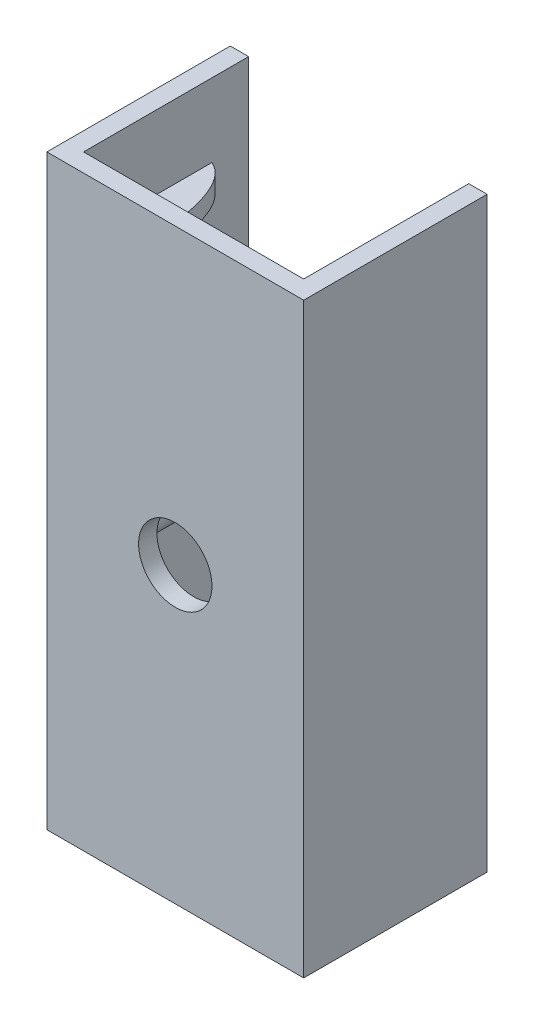
ISO-10303-21;
HEADER;
FILE_DESCRIPTION(('STEP AP214'),'2;1');
FILE_NAME('part.step','',(''),(''),'','','');
FILE_SCHEMA(('AUTOMOTIVE_DESIGN { 1 0 10303 214 1 1 1 1 }'));
ENDSEC;
DATA;
#1=APPLICATION_CONTEXT('core data for automotive mechanical design processes');
#2=APPLICATION_PROTOCOL_DEFINITION('international standard','automotive_design',2000,#1);
#3=PRODUCT_CONTEXT('',#1,'mechanical');
#4=PRODUCT('Part','Part','',(#3));
#5=PRODUCT_RELATED_PRODUCT_CATEGORY('part','',(#4));
#6=PRODUCT_DEFINITION_FORMATION('','',#4);
#7=PRODUCT_DEFINITION_CONTEXT('part definition',#1,'design');
#8=PRODUCT_DEFINITION('design','',#6,#7);
#9=PRODUCT_DEFINITION_SHAPE('','',#8);
#10=(LENGTH_UNIT() NAMED_UNIT(*) SI_UNIT(.MILLI.,.METRE.));
#11=(NAMED_UNIT(*) PLANE_ANGLE_UNIT() SI_UNIT($,.RADIAN.));
#12=(NAMED_UNIT(*) SI_UNIT($,.STERADIAN.) SOLID_ANGLE_UNIT());
#13=UNCERTAINTY_MEASURE_WITH_UNIT(LENGTH_MEASURE(1.E-05),#10,'distance_accuracy_value','');
#14=(GEOMETRIC_REPRESENTATION_CONTEXT(3) GLOBAL_UNCERTAINTY_ASSIGNED_CONTEXT((#13)) GLOBAL_UNIT_ASSIGNED_CONTEXT((#10,
#11,#12)) REPRESENTATION_CONTEXT('',''));
#15=CARTESIAN_POINT('',(0.,0.,0.));
#16=DIRECTION('',(0.,0.,1.));
#17=DIRECTION('',(1.,0.,0.));
#18=AXIS2_PLACEMENT_3D('',#15,#16,#17);
#19=CARTESIAN_POINT('',(0.,0.,-1000.));
#20=DIRECTION('',(0.,0.,1.));
#21=DIRECTION('',(1.,0.,0.));
#22=AXIS2_PLACEMENT_3D('',#19,#20,#21);
#23=PLANE('',#22);
#24=CARTESIAN_POINT('',(124743.416897498,168337.836627923,-1000.));
#25=DIRECTION('',(0.,0.,1.));
#26=DIRECTION('',(1.,0.,0.));
#27=AXIS2_PLACEMENT_3D('',#24,#25,#26);
#28=CIRCLE('',#27,2000.);
#29=CARTESIAN_POINT('',(126743.416897498,168337.836627923,-1000.));
#30=VERTEX_POINT('',#29);
#31=EDGE_CURVE('E490',#30,#30,#28,.T.);
#32=ORIENTED_EDGE('',*,*,#31,.T.);
#33=EDGE_LOOP('',(#32));
#34=FACE_BOUND('',#33,.T.);
#35=DIRECTION('',(0.,-1.,0.));
#36=VECTOR('',#35,1.);
#37=CARTESIAN_POINT('',(130743.416897498,0.,-1000.));
#38=LINE('',#37,#36);
#39=CARTESIAN_POINT('',(130743.416897498,184337.836627923,-1000.));
#40=VERTEX_POINT('',#39);
#41=CARTESIAN_POINT('',(130743.416897498,180337.836627923,-1000.));
#42=VERTEX_POINT('',#41);
#43=EDGE_CURVE('E493',#40,#42,#38,.T.);
#44=ORIENTED_EDGE('',*,*,#43,.T.);
#45=DIRECTION('',(-1.,0.,0.));
#46=VECTOR('',#45,1.);
#47=CARTESIAN_POINT('',(-1.48029736616685E-13,180337.836627923,-999.999999999984));
#48=LINE('',#47,#46);
#49=CARTESIAN_POINT('',(128743.416897498,180337.836627923,-1000.));
#50=VERTEX_POINT('',#49);
#51=EDGE_CURVE('E262',#42,#50,#48,.T.);
#52=ORIENTED_EDGE('',*,*,#51,.T.);
#53=DIRECTION('',(0.,-1.,0.));
#54=VECTOR('',#53,1.);
#55=CARTESIAN_POINT('',(128743.416897498,180337.836627923,-1000.));
#56=LINE('',#55,#54);
#57=CARTESIAN_POINT('',(128743.416897498,179337.836627923,-1000.));
#58=VERTEX_POINT('',#57);
#59=EDGE_CURVE('E256',#50,#58,#56,.T.);
#60=ORIENTED_EDGE('',*,*,#59,.T.);
#61=DIRECTION('',(-1.,0.,0.));
#62=VECTOR('',#61,1.);
#63=CARTESIAN_POINT('',(-1.48029736616685E-13,179337.836627923,-999.999999999984));
#64=LINE('',#63,#62);
#65=CARTESIAN_POINT('',(130743.416897498,179337.836627923,-1000.));
#66=VERTEX_POINT('',#65);
#67=EDGE_CURVE('E245',#66,#58,#64,.T.);
#68=ORIENTED_EDGE('',*,*,#67,.F.);
#69=CARTESIAN_POINT('',(130743.416897498,170237.836627923,-1000.));
#70=VERTEX_POINT('',#69);
#71=EDGE_CURVE('E498',#66,#70,#38,.T.);
#72=ORIENTED_EDGE('',*,*,#71,.T.);
#73=DIRECTION('',(-1.,0.,0.));
#74=VECTOR('',#73,1.);
#75=CARTESIAN_POINT('',(0.,170237.836627923,-1000.));
#76=LINE('',#75,#74);
#77=CARTESIAN_POINT('',(129243.416897498,170237.836627923,-1000.));
#78=VERTEX_POINT('',#77);
#79=EDGE_CURVE('E519',#70,#78,#76,.T.);
#80=ORIENTED_EDGE('',*,*,#79,.T.);
#81=CARTESIAN_POINT('',(129243.416897498,168837.836627923,-1000.));
#82=DIRECTION('',(0.,0.,1.));
#83=DIRECTION('',(1.,0.,0.));
#84=AXIS2_PLACEMENT_3D('',#81,#82,#83);
#85=CIRCLE('',#84,1400.00000000001);
#86=CARTESIAN_POINT('',(127843.416897498,168837.836627923,-1000.));
#87=VERTEX_POINT('',#86);
#88=EDGE_CURVE('E516',#78,#87,#85,.T.);
#89=ORIENTED_EDGE('',*,*,#88,.T.);
#90=DIRECTION('',(0.,-1.,0.));
#91=VECTOR('',#90,1.);
#92=CARTESIAN_POINT('',(127843.416897496,-1.81676422382531E-09,-1000.));
#93=LINE('',#92,#91);
#94=CARTESIAN_POINT('',(127843.416897498,167837.836627923,-1000.));
#95=VERTEX_POINT('',#94);
#96=EDGE_CURVE('E513',#87,#95,#93,.T.);
#97=ORIENTED_EDGE('',*,*,#96,.T.);
#98=CARTESIAN_POINT('',(129243.416897498,167837.836627923,-1000.));
#99=DIRECTION('',(0.,0.,1.));
#100=DIRECTION('',(1.,0.,0.));
#101=AXIS2_PLACEMENT_3D('',#98,#99,#100);
#102=CIRCLE('',#101,1400.00000000001);
#103=CARTESIAN_POINT('',(129243.416897498,166437.836627923,-1000.));
#104=VERTEX_POINT('',#103);
#105=EDGE_CURVE('E510',#95,#104,#102,.T.);
#106=ORIENTED_EDGE('',*,*,#105,.T.);
#107=DIRECTION('',(1.,0.,0.));
#108=VECTOR('',#107,1.);
#109=CARTESIAN_POINT('',(0.,166437.836627923,-1000.));
#110=LINE('',#109,#108);
#111=CARTESIAN_POINT('',(130743.416897498,166437.836627923,-1000.));
#112=VERTEX_POINT('',#111);
#113=EDGE_CURVE('E507',#104,#112,#110,.T.);
#114=ORIENTED_EDGE('',*,*,#113,.T.);
#115=DIRECTION('',(0.,-1.,0.));
#116=VECTOR('',#115,1.);
#117=CARTESIAN_POINT('',(130743.416897498,0.,-1000.));
#118=LINE('',#117,#116);
#119=CARTESIAN_POINT('',(130743.416897498,157337.836627923,-1000.));
#120=VERTEX_POINT('',#119);
#121=EDGE_CURVE('E500',#112,#120,#118,.T.);
#122=ORIENTED_EDGE('',*,*,#121,.T.);
#123=DIRECTION('',(-1.,0.,0.));
#124=VECTOR('',#123,1.);
#125=CARTESIAN_POINT('',(-1.48029736616685E-13,157337.836627923,-999.999999999984));
#126=LINE('',#125,#124);
#127=CARTESIAN_POINT('',(128743.416897498,157337.836627923,-1000.));
#128=VERTEX_POINT('',#127);
#129=EDGE_CURVE('E344',#120,#128,#126,.T.);
#130=ORIENTED_EDGE('',*,*,#129,.T.);
#131=DIRECTION('',(0.,1.,0.));
#132=VECTOR('',#131,1.);
#133=CARTESIAN_POINT('',(128743.416897498,156337.836627923,-1000.));
#134=LINE('',#133,#132);
#135=CARTESIAN_POINT('',(128743.416897498,156337.836627923,-1000.));
#136=VERTEX_POINT('',#135);
#137=EDGE_CURVE('E636',#136,#128,#134,.T.);
#138=ORIENTED_EDGE('',*,*,#137,.F.);
#139=DIRECTION('',(-1.,0.,0.));
#140=VECTOR('',#139,1.);
#141=CARTESIAN_POINT('',(-1.48029736616685E-13,156337.836627923,-999.999999999984));
#142=LINE('',#141,#140);
#143=CARTESIAN_POINT('',(130743.416897498,156337.836627923,-1000.));
#144=VERTEX_POINT('',#143);
#145=EDGE_CURVE('E358',#144,#136,#142,.T.);
#146=ORIENTED_EDGE('',*,*,#145,.F.);
#147=CARTESIAN_POINT('',(130743.416897498,152337.836627923,-1000.));
#148=VERTEX_POINT('',#147);
#149=EDGE_CURVE('E504',#144,#148,#118,.T.);
#150=ORIENTED_EDGE('',*,*,#149,.T.);
#151=DIRECTION('',(1.,0.,0.));
#152=VECTOR('',#151,1.);
#153=CARTESIAN_POINT('',(0.,152337.836627923,-1000.));
#154=LINE('',#153,#152);
#155=CARTESIAN_POINT('',(118743.416897498,152337.836627923,-1000.));
#156=VERTEX_POINT('',#155);
#157=EDGE_CURVE('E479',#156,#148,#154,.T.);
#158=ORIENTED_EDGE('',*,*,#157,.F.);
#159=DIRECTION('',(0.,1.,0.));
#160=VECTOR('',#159,1.);
#161=CARTESIAN_POINT('',(118743.416897498,0.,-1000.));
#162=LINE('',#161,#160);
#163=CARTESIAN_POINT('',(118743.416897498,156337.836627923,-1000.));
#164=VERTEX_POINT('',#163);
#165=EDGE_CURVE('E584',#156,#164,#162,.T.);
#166=ORIENTED_EDGE('',*,*,#165,.T.);
#167=DIRECTION('',(-1.,0.,0.));
#168=VECTOR('',#167,1.);
#169=CARTESIAN_POINT('',(-1.48029736616685E-13,156337.836627923,-999.999999999984));
#170=LINE('',#169,#168);
#171=CARTESIAN_POINT('',(120743.416897498,156337.836627923,-1000.));
#172=VERTEX_POINT('',#171);
#173=EDGE_CURVE('E322',#172,#164,#170,.T.);
#174=ORIENTED_EDGE('',*,*,#173,.F.);
#175=DIRECTION('',(0.,-1.,0.));
#176=VECTOR('',#175,1.);
#177=CARTESIAN_POINT('',(120743.416897498,157337.836627923,-1000.));
#178=LINE('',#177,#176);
#179=CARTESIAN_POINT('',(120743.416897498,157337.836627923,-1000.));
#180=VERTEX_POINT('',#179);
#181=EDGE_CURVE('E332',#180,#172,#178,.T.);
#182=ORIENTED_EDGE('',*,*,#181,.F.);
#183=DIRECTION('',(-1.,0.,0.));
#184=VECTOR('',#183,1.);
#185=CARTESIAN_POINT('',(-1.48029736616685E-13,157337.836627923,-999.999999999984));
#186=LINE('',#185,#184);
#187=CARTESIAN_POINT('',(118743.416897498,157337.836627923,-1000.));
#188=VERTEX_POINT('',#187);
#189=EDGE_CURVE('E329',#180,#188,#186,.T.);
#190=ORIENTED_EDGE('',*,*,#189,.T.);
#191=CARTESIAN_POINT('',(118743.416897498,166437.836627923,-1000.));
#192=VERTEX_POINT('',#191);
#193=EDGE_CURVE('E587',#188,#192,#162,.T.);
#194=ORIENTED_EDGE('',*,*,#193,.T.);
#195=DIRECTION('',(-1.,0.,0.));
#196=VECTOR('',#195,1.);
#197=CARTESIAN_POINT('',(0.,166437.836627923,-1000.));
#198=LINE('',#197,#196);
#199=CARTESIAN_POINT('',(120243.416897498,166437.836627923,-1000.));
#200=VERTEX_POINT('',#199);
#201=EDGE_CURVE('E581',#200,#192,#198,.T.);
#202=ORIENTED_EDGE('',*,*,#201,.F.);
#203=CARTESIAN_POINT('',(120243.416897498,167837.836627923,-1000.));
#204=DIRECTION('',(0.,0.,1.));
#205=DIRECTION('',(1.,0.,0.));
#206=AXIS2_PLACEMENT_3D('',#203,#204,#205);
#207=CIRCLE('',#206,1400.00000000001);
#208=CARTESIAN_POINT('',(121643.416897498,167837.836627923,-1000.));
#209=VERTEX_POINT('',#208);
#210=EDGE_CURVE('E579',#209,#200,#207,.F.);
#211=ORIENTED_EDGE('',*,*,#210,.F.);
#212=DIRECTION('',(0.,-1.,0.));
#213=VECTOR('',#212,1.);
#214=CARTESIAN_POINT('',(121643.416897501,1.72865692459113E-09,-1000.));
#215=LINE('',#214,#213);
#216=CARTESIAN_POINT('',(121643.416897498,168837.836627923,-1000.));
#217=VERTEX_POINT('',#216);
#218=EDGE_CURVE('E577',#217,#209,#215,.T.);
#219=ORIENTED_EDGE('',*,*,#218,.F.);
#220=CARTESIAN_POINT('',(120243.416897498,168837.836627923,-1000.));
#221=DIRECTION('',(0.,0.,1.));
#222=DIRECTION('',(1.,0.,0.));
#223=AXIS2_PLACEMENT_3D('',#220,#221,#222);
#224=CIRCLE('',#223,1400.00000000001);
#225=CARTESIAN_POINT('',(120243.416897498,170237.836627923,-1000.));
#226=VERTEX_POINT('',#225);
#227=EDGE_CURVE('E575',#226,#217,#224,.F.);
#228=ORIENTED_EDGE('',*,*,#227,.F.);
#229=DIRECTION('',(1.,0.,0.));
#230=VECTOR('',#229,1.);
#231=CARTESIAN_POINT('',(0.,170237.836627923,-1000.));
#232=LINE('',#231,#230);
#233=CARTESIAN_POINT('',(118743.416897498,170237.836627923,-1000.));
#234=VERTEX_POINT('',#233);
#235=EDGE_CURVE('E573',#234,#226,#232,.T.);
#236=ORIENTED_EDGE('',*,*,#235,.F.);
#237=DIRECTION('',(0.,1.,0.));
#238=VECTOR('',#237,1.);
#239=CARTESIAN_POINT('',(118743.416897498,0.,-1000.));
#240=LINE('',#239,#238);
#241=CARTESIAN_POINT('',(118743.416897498,179337.836627923,-1000.));
#242=VERTEX_POINT('',#241);
#243=EDGE_CURVE('E570',#234,#242,#240,.T.);
#244=ORIENTED_EDGE('',*,*,#243,.T.);
#245=DIRECTION('',(-1.,0.,0.));
#246=VECTOR('',#245,1.);
#247=CARTESIAN_POINT('',(-1.48029736616685E-13,179337.836627923,-999.999999999984));
#248=LINE('',#247,#246);
#249=CARTESIAN_POINT('',(120743.416897498,179337.836627923,-999.999999999993));
#250=VERTEX_POINT('',#249);
#251=EDGE_CURVE('E60',#250,#242,#248,.T.);
#252=ORIENTED_EDGE('',*,*,#251,.F.);
#253=DIRECTION('',(0.,1.,0.));
#254=VECTOR('',#253,1.);
#255=CARTESIAN_POINT('',(120743.416897498,179337.836627923,-1000.));
#256=LINE('',#255,#254);
#257=CARTESIAN_POINT('',(120743.416897498,180337.836627923,-1000.));
#258=VERTEX_POINT('',#257);
#259=EDGE_CURVE('E668',#250,#258,#256,.T.);
#260=ORIENTED_EDGE('',*,*,#259,.T.);
#261=DIRECTION('',(-1.,0.,0.));
#262=VECTOR('',#261,1.);
#263=CARTESIAN_POINT('',(-1.48029736616685E-13,180337.836627923,-999.999999999984));
#264=LINE('',#263,#262);
#265=CARTESIAN_POINT('',(118743.416897498,180337.836627923,-1000.));
#266=VERTEX_POINT('',#265);
#267=EDGE_CURVE('E279',#258,#266,#264,.T.);
#268=ORIENTED_EDGE('',*,*,#267,.T.);
#269=CARTESIAN_POINT('',(118743.416897498,184337.836627923,-1000.));
#270=VERTEX_POINT('',#269);
#271=EDGE_CURVE('E572',#266,#270,#240,.T.);
#272=ORIENTED_EDGE('',*,*,#271,.T.);
#273=DIRECTION('',(-1.,0.,0.));
#274=VECTOR('',#273,1.);
#275=CARTESIAN_POINT('',(0.,184337.836627923,-1000.));
#276=LINE('',#275,#274);
#277=EDGE_CURVE('E484',#40,#270,#276,.T.);
#278=ORIENTED_EDGE('',*,*,#277,.F.);
#279=EDGE_LOOP('',(#44,#52,#60,#68,#72,#80,#89,#97,#106,#114,#122,#130,#138,#146,#150,#158,#166,
#174,#182,#190,#194,#202,#211,#219,#228,#236,#244,#252,#260,#268,#272,#278));
#280=FACE_BOUND('',#279,.T.);
#281=ADVANCED_FACE('F35',(#34,#280),#23,.F.);
#282=CARTESIAN_POINT('',(118743.416897498,0.,-10000.));
#283=DIRECTION('',(1.,0.,0.));
#284=DIRECTION('',(0.,0.,-1.));
#285=AXIS2_PLACEMENT_3D('',#282,#283,#284);
#286=PLANE('',#285);
#287=DIRECTION('',(0.,1.,0.));
#288=VECTOR('',#287,1.);
#289=CARTESIAN_POINT('',(118743.416897498,179337.836627923,-8000.));
#290=LINE('',#289,#288);
#291=CARTESIAN_POINT('',(118743.416897498,179337.836627923,-8000.00000000018));
#292=VERTEX_POINT('',#291);
#293=CARTESIAN_POINT('',(118743.416897498,180337.836627923,-8000.00000000014));
#294=VERTEX_POINT('',#293);
#295=EDGE_CURVE('E673',#292,#294,#290,.T.);
#296=ORIENTED_EDGE('',*,*,#295,.F.);
#297=DIRECTION('',(0.,0.,-1.));
#298=VECTOR('',#297,1.);
#299=CARTESIAN_POINT('',(118743.416897498,179337.836627923,0.));
#300=LINE('',#299,#298);
#301=EDGE_CURVE('E287',#242,#292,#300,.T.);
#302=ORIENTED_EDGE('',*,*,#301,.F.);
#303=ORIENTED_EDGE('',*,*,#243,.F.);
#304=DIRECTION('',(0.,0.,1.));
#305=VECTOR('',#304,1.);
#306=CARTESIAN_POINT('',(118743.416897498,170237.836627923,-10000.));
#307=LINE('',#306,#305);
#308=CARTESIAN_POINT('',(118743.416897498,170237.836627923,-10000.));
#309=VERTEX_POINT('',#308);
#310=EDGE_CURVE('E606',#309,#234,#307,.T.);
#311=ORIENTED_EDGE('',*,*,#310,.F.);
#312=DIRECTION('',(0.,1.,0.));
#313=VECTOR('',#312,1.);
#314=CARTESIAN_POINT('',(118743.416897498,0.,-10000.));
#315=LINE('',#314,#313);
#316=CARTESIAN_POINT('',(118743.416897498,184337.836627923,-10000.));
#317=VERTEX_POINT('',#316);
#318=EDGE_CURVE('E591',#309,#317,#315,.T.);
#319=ORIENTED_EDGE('',*,*,#318,.T.);
#320=DIRECTION('',(0.,0.,1.));
#321=VECTOR('',#320,1.);
#322=CARTESIAN_POINT('',(118743.416897498,184337.836627923,-10000.));
#323=LINE('',#322,#321);
#324=EDGE_CURVE('E609',#317,#270,#323,.T.);
#325=ORIENTED_EDGE('',*,*,#324,.T.);
#326=ORIENTED_EDGE('',*,*,#271,.F.);
#327=DIRECTION('',(0.,0.,-1.));
#328=VECTOR('',#327,1.);
#329=CARTESIAN_POINT('',(118743.416897498,180337.836627923,0.));
#330=LINE('',#329,#328);
#331=EDGE_CURVE('E274',#266,#294,#330,.T.);
#332=ORIENTED_EDGE('',*,*,#331,.T.);
#333=EDGE_LOOP('',(#296,#302,#303,#311,#319,#325,#326,#332));
#334=FACE_BOUND('',#333,.T.);
#335=ADVANCED_FACE('F374',(#334),#286,.T.);
#336=CARTESIAN_POINT('',(130743.416897498,0.,-10000.));
#337=DIRECTION('',(-1.,0.,0.));
#338=DIRECTION('',(0.,0.,1.));
#339=AXIS2_PLACEMENT_3D('',#336,#337,#338);
#340=PLANE('',#339);
#341=ORIENTED_EDGE('',*,*,#149,.F.);
#342=DIRECTION('',(0.,0.,1.));
#343=VECTOR('',#342,1.);
#344=CARTESIAN_POINT('',(130743.416897498,156337.836627923,0.));
#345=LINE('',#344,#343);
#346=CARTESIAN_POINT('',(130743.416897498,156337.836627923,-8000.));
#347=VERTEX_POINT('',#346);
#348=EDGE_CURVE('E349',#347,#144,#345,.T.);
#349=ORIENTED_EDGE('',*,*,#348,.F.);
#350=DIRECTION('',(0.,1.,0.));
#351=VECTOR('',#350,1.);
#352=CARTESIAN_POINT('',(130743.416897498,156337.836627923,-8000.));
#353=LINE('',#352,#351);
#354=CARTESIAN_POINT('',(130743.416897498,157337.836627923,-8000.));
#355=VERTEX_POINT('',#354);
#356=EDGE_CURVE('E637',#347,#355,#353,.T.);
#357=ORIENTED_EDGE('',*,*,#356,.T.);
#358=DIRECTION('',(0.,0.,1.));
#359=VECTOR('',#358,1.);
#360=CARTESIAN_POINT('',(130743.416897498,157337.836627923,0.));
#361=LINE('',#360,#359);
#362=EDGE_CURVE('E337',#355,#120,#361,.T.);
#363=ORIENTED_EDGE('',*,*,#362,.T.);
#364=ORIENTED_EDGE('',*,*,#121,.F.);
#365=DIRECTION('',(0.,0.,1.));
#366=VECTOR('',#365,1.);
#367=CARTESIAN_POINT('',(130743.416897498,166437.836627923,-10000.));
#368=LINE('',#367,#366);
#369=CARTESIAN_POINT('',(130743.416897498,166437.836627923,-10000.));
#370=VERTEX_POINT('',#369);
#371=EDGE_CURVE('E537',#370,#112,#368,.T.);
#372=ORIENTED_EDGE('',*,*,#371,.F.);
#373=DIRECTION('',(0.,-1.,0.));
#374=VECTOR('',#373,1.);
#375=CARTESIAN_POINT('',(130743.416897498,0.,-10000.));
#376=LINE('',#375,#374);
#377=CARTESIAN_POINT('',(130743.416897498,152337.836627923,-10000.));
#378=VERTEX_POINT('',#377);
#379=EDGE_CURVE('E549',#370,#378,#376,.T.);
#380=ORIENTED_EDGE('',*,*,#379,.T.);
#381=DIRECTION('',(0.,0.,1.));
#382=VECTOR('',#381,1.);
#383=CARTESIAN_POINT('',(130743.416897498,152337.836627923,-10000.));
#384=LINE('',#383,#382);
#385=EDGE_CURVE('E540',#378,#148,#384,.T.);
#386=ORIENTED_EDGE('',*,*,#385,.T.);
#387=EDGE_LOOP('',(#341,#349,#357,#363,#364,#372,#380,#386));
#388=FACE_BOUND('',#387,.T.);
#389=ADVANCED_FACE('F377',(#388),#340,.T.);
#390=CARTESIAN_POINT('',(117743.416897498,0.,-1000.));
#391=DIRECTION('',(-1.,0.,0.));
#392=DIRECTION('',(0.,0.,1.));
#393=AXIS2_PLACEMENT_3D('',#390,#391,#392);
#394=PLANE('',#393);
#395=DIRECTION('',(0.,-1.,0.));
#396=VECTOR('',#395,1.);
#397=CARTESIAN_POINT('',(117743.416897498,0.,0.));
#398=LINE('',#397,#396);
#399=CARTESIAN_POINT('',(117743.416897498,184337.836627923,0.));
#400=VERTEX_POINT('',#399);
#401=CARTESIAN_POINT('',(117743.416897498,152337.836627923,0.));
#402=VERTEX_POINT('',#401);
#403=EDGE_CURVE('E474',#400,#402,#398,.T.);
#404=ORIENTED_EDGE('',*,*,#403,.F.);
#405=DIRECTION('',(0.,0.,1.));
#406=VECTOR('',#405,1.);
#407=CARTESIAN_POINT('',(117743.416897498,184337.836627923,-1000.));
#408=LINE('',#407,#406);
#409=CARTESIAN_POINT('',(117743.416897498,184337.836627923,-10000.));
#410=VERTEX_POINT('',#409);
#411=EDGE_CURVE('E11',#410,#400,#408,.T.);
#412=ORIENTED_EDGE('',*,*,#411,.F.);
#413=DIRECTION('',(0.,-1.,0.));
#414=VECTOR('',#413,1.);
#415=CARTESIAN_POINT('',(117743.416897498,0.,-10000.));
#416=LINE('',#415,#414);
#417=CARTESIAN_POINT('',(117743.416897498,152337.836627923,-10000.));
#418=VERTEX_POINT('',#417);
#419=EDGE_CURVE('E630',#410,#418,#416,.T.);
#420=ORIENTED_EDGE('',*,*,#419,.T.);
#421=DIRECTION('',(0.,0.,1.));
#422=VECTOR('',#421,1.);
#423=CARTESIAN_POINT('',(117743.416897498,152337.836627923,-1000.));
#424=LINE('',#423,#422);
#425=EDGE_CURVE('E39',#418,#402,#424,.T.);
#426=ORIENTED_EDGE('',*,*,#425,.T.);
#427=EDGE_LOOP('',(#404,#412,#420,#426));
#428=FACE_BOUND('',#427,.T.);
#429=ADVANCED_FACE('F37',(#428),#394,.T.);
#430=CARTESIAN_POINT('',(0.,184337.836627923,-1000.));
#431=DIRECTION('',(0.,1.,0.));
#432=DIRECTION('',(0.,0.,1.));
#433=AXIS2_PLACEMENT_3D('',#430,#431,#432);
#434=PLANE('',#433);
#435=ORIENTED_EDGE('',*,*,#277,.T.);
#436=ORIENTED_EDGE('',*,*,#324,.F.);
#437=DIRECTION('',(-1.,0.,0.));
#438=VECTOR('',#437,1.);
#439=CARTESIAN_POINT('',(0.,184337.836627923,-10000.));
#440=LINE('',#439,#438);
#441=EDGE_CURVE('E633',#317,#410,#440,.T.);
#442=ORIENTED_EDGE('',*,*,#441,.T.);
#443=ORIENTED_EDGE('',*,*,#411,.T.);
#444=DIRECTION('',(-1.,0.,0.));
#445=VECTOR('',#444,1.);
#446=CARTESIAN_POINT('',(0.,184337.836627923,0.));
#447=LINE('',#446,#445);
#448=CARTESIAN_POINT('',(131743.416897498,184337.836627923,0.));
#449=VERTEX_POINT('',#448);
#450=EDGE_CURVE('E470',#449,#400,#447,.T.);
#451=ORIENTED_EDGE('',*,*,#450,.F.);
#452=DIRECTION('',(0.,0.,1.));
#453=VECTOR('',#452,1.);
#454=CARTESIAN_POINT('',(131743.416897498,184337.836627923,-1000.));
#455=LINE('',#454,#453);
#456=CARTESIAN_POINT('',(131743.416897498,184337.836627923,-10000.));
#457=VERTEX_POINT('',#456);
#458=EDGE_CURVE('E44',#457,#449,#455,.T.);
#459=ORIENTED_EDGE('',*,*,#458,.F.);
#460=DIRECTION('',(-1.,0.,0.));
#461=VECTOR('',#460,1.);
#462=CARTESIAN_POINT('',(0.,184337.836627923,-10000.));
#463=LINE('',#462,#461);
#464=CARTESIAN_POINT('',(130743.416897498,184337.836627923,-10000.));
#465=VERTEX_POINT('',#464);
#466=EDGE_CURVE('E526',#457,#465,#463,.T.);
#467=ORIENTED_EDGE('',*,*,#466,.T.);
#468=DIRECTION('',(0.,0.,1.));
#469=VECTOR('',#468,1.);
#470=CARTESIAN_POINT('',(130743.416897498,184337.836627923,-10000.));
#471=LINE('',#470,#469);
#472=EDGE_CURVE('E521',#465,#40,#471,.T.);
#473=ORIENTED_EDGE('',*,*,#472,.T.);
#474=EDGE_LOOP('',(#435,#436,#442,#443,#451,#459,#467,#473));
#475=FACE_BOUND('',#474,.T.);
#476=ADVANCED_FACE('F445',(#475),#434,.T.);
#477=CARTESIAN_POINT('',(131743.416897498,0.,-1000.));
#478=DIRECTION('',(1.,0.,0.));
#479=DIRECTION('',(0.,0.,-1.));
#480=AXIS2_PLACEMENT_3D('',#477,#478,#479);
#481=PLANE('',#480);
#482=DIRECTION('',(0.,1.,0.));
#483=VECTOR('',#482,1.);
#484=CARTESIAN_POINT('',(131743.416897498,0.,0.));
#485=LINE('',#484,#483);
#486=CARTESIAN_POINT('',(131743.416897498,152337.836627923,0.));
#487=VERTEX_POINT('',#486);
#488=EDGE_CURVE('E468',#487,#449,#485,.T.);
#489=ORIENTED_EDGE('',*,*,#488,.F.);
#490=DIRECTION('',(0.,0.,1.));
#491=VECTOR('',#490,1.);
#492=CARTESIAN_POINT('',(131743.416897498,152337.836627923,-1000.));
#493=LINE('',#492,#491);
#494=CARTESIAN_POINT('',(131743.416897498,152337.836627923,-10000.));
#495=VERTEX_POINT('',#494);
#496=EDGE_CURVE('E459',#495,#487,#493,.T.);
#497=ORIENTED_EDGE('',*,*,#496,.F.);
#498=DIRECTION('',(0.,1.,0.));
#499=VECTOR('',#498,1.);
#500=CARTESIAN_POINT('',(131743.416897498,0.,-10000.));
#501=LINE('',#500,#499);
#502=EDGE_CURVE('E546',#495,#457,#501,.T.);
#503=ORIENTED_EDGE('',*,*,#502,.T.);
#504=ORIENTED_EDGE('',*,*,#458,.T.);
#505=EDGE_LOOP('',(#489,#497,#503,#504));
#506=FACE_BOUND('',#505,.T.);
#507=ADVANCED_FACE('F448',(#506),#481,.T.);
#508=CARTESIAN_POINT('',(0.,152337.836627923,-1000.));
#509=DIRECTION('',(0.,-1.,0.));
#510=DIRECTION('',(0.,0.,-1.));
#511=AXIS2_PLACEMENT_3D('',#508,#509,#510);
#512=PLANE('',#511);
#513=ORIENTED_EDGE('',*,*,#496,.T.);
#514=DIRECTION('',(1.,0.,0.));
#515=VECTOR('',#514,1.);
#516=CARTESIAN_POINT('',(0.,152337.836627923,0.));
#517=LINE('',#516,#515);
#518=EDGE_CURVE('E461',#402,#487,#517,.T.);
#519=ORIENTED_EDGE('',*,*,#518,.F.);
#520=ORIENTED_EDGE('',*,*,#425,.F.);
#521=DIRECTION('',(1.,0.,0.));
#522=VECTOR('',#521,1.);
#523=CARTESIAN_POINT('',(0.,152337.836627923,-10000.));
#524=LINE('',#523,#522);
#525=CARTESIAN_POINT('',(118743.416897498,152337.836627923,-10000.));
#526=VERTEX_POINT('',#525);
#527=EDGE_CURVE('E627',#418,#526,#524,.T.);
#528=ORIENTED_EDGE('',*,*,#527,.T.);
#529=DIRECTION('',(0.,0.,1.));
#530=VECTOR('',#529,1.);
#531=CARTESIAN_POINT('',(118743.416897498,152337.836627923,-10000.));
#532=LINE('',#531,#530);
#533=EDGE_CURVE('E588',#526,#156,#532,.T.);
#534=ORIENTED_EDGE('',*,*,#533,.T.);
#535=ORIENTED_EDGE('',*,*,#157,.T.);
#536=ORIENTED_EDGE('',*,*,#385,.F.);
#537=DIRECTION('',(1.,0.,0.));
#538=VECTOR('',#537,1.);
#539=CARTESIAN_POINT('',(0.,152337.836627923,-10000.));
#540=LINE('',#539,#538);
#541=EDGE_CURVE('E464',#378,#495,#540,.T.);
#542=ORIENTED_EDGE('',*,*,#541,.T.);
#543=EDGE_LOOP('',(#513,#519,#520,#528,#534,#535,#536,#542));
#544=FACE_BOUND('',#543,.T.);
#545=ADVANCED_FACE('F443',(#544),#512,.T.);
#546=CARTESIAN_POINT('',(124743.416897498,168337.836627923,-1000.));
#547=DIRECTION('',(0.,0.,1.));
#548=DIRECTION('',(1.,0.,0.));
#549=AXIS2_PLACEMENT_3D('',#546,#547,#548);
#550=CYLINDRICAL_SURFACE('',#549,2000.);
#551=ORIENTED_EDGE('',*,*,#31,.F.);
#552=EDGE_LOOP('',(#551));
#553=FACE_BOUND('',#552,.T.);
#554=CARTESIAN_POINT('',(124743.416897498,168337.836627923,0.));
#555=DIRECTION('',(0.,0.,1.));
#556=DIRECTION('',(1.,0.,0.));
#557=AXIS2_PLACEMENT_3D('',#554,#555,#556);
#558=CIRCLE('',#557,2000.);
#559=CARTESIAN_POINT('',(126743.416897498,168337.836627923,0.));
#560=VERTEX_POINT('',#559);
#561=EDGE_CURVE('E472',#560,#560,#558,.T.);
#562=ORIENTED_EDGE('',*,*,#561,.T.);
#563=EDGE_LOOP('',(#562));
#564=FACE_BOUND('',#563,.T.);
#565=ADVANCED_FACE('F439',(#553,#564),#550,.F.);
#566=CARTESIAN_POINT('',(0.,0.,0.));
#567=DIRECTION('',(0.,0.,1.));
#568=DIRECTION('',(1.,0.,0.));
#569=AXIS2_PLACEMENT_3D('',#566,#567,#568);
#570=PLANE('',#569);
#571=ORIENTED_EDGE('',*,*,#450,.T.);
#572=ORIENTED_EDGE('',*,*,#403,.T.);
#573=ORIENTED_EDGE('',*,*,#518,.T.);
#574=ORIENTED_EDGE('',*,*,#488,.T.);
#575=EDGE_LOOP('',(#571,#572,#573,#574));
#576=FACE_BOUND('',#575,.T.);
#577=ORIENTED_EDGE('',*,*,#561,.F.);
#578=EDGE_LOOP('',(#577));
#579=FACE_BOUND('',#578,.T.);
#580=ADVANCED_FACE('F432',(#576,#579),#570,.T.);
#581=CARTESIAN_POINT('',(130743.416897498,0.,-10000.));
#582=DIRECTION('',(-1.,0.,0.));
#583=DIRECTION('',(0.,0.,1.));
#584=AXIS2_PLACEMENT_3D('',#581,#582,#583);
#585=PLANE('',#584);
#586=DIRECTION('',(0.,0.,1.));
#587=VECTOR('',#586,1.);
#588=CARTESIAN_POINT('',(130743.416897498,180337.836627923,0.));
#589=LINE('',#588,#587);
#590=CARTESIAN_POINT('',(130743.416897498,180337.836627923,-8000.));
#591=VERTEX_POINT('',#590);
#592=EDGE_CURVE('E251',#591,#42,#589,.T.);
#593=ORIENTED_EDGE('',*,*,#592,.T.);
#594=ORIENTED_EDGE('',*,*,#43,.F.);
#595=ORIENTED_EDGE('',*,*,#472,.F.);
#596=DIRECTION('',(0.,-1.,0.));
#597=VECTOR('',#596,1.);
#598=CARTESIAN_POINT('',(130743.416897498,0.,-10000.));
#599=LINE('',#598,#597);
#600=CARTESIAN_POINT('',(130743.416897498,170237.836627923,-10000.));
#601=VERTEX_POINT('',#600);
#602=EDGE_CURVE('E567',#465,#601,#599,.T.);
#603=ORIENTED_EDGE('',*,*,#602,.T.);
#604=DIRECTION('',(0.,0.,1.));
#605=VECTOR('',#604,1.);
#606=CARTESIAN_POINT('',(130743.416897498,170237.836627923,-10000.));
#607=LINE('',#606,#605);
#608=EDGE_CURVE('E522',#601,#70,#607,.T.);
#609=ORIENTED_EDGE('',*,*,#608,.T.);
#610=ORIENTED_EDGE('',*,*,#71,.F.);
#611=DIRECTION('',(0.,0.,1.));
#612=VECTOR('',#611,1.);
#613=CARTESIAN_POINT('',(130743.416897498,179337.836627923,0.));
#614=LINE('',#613,#612);
#615=CARTESIAN_POINT('',(130743.416897498,179337.836627923,-8000.));
#616=VERTEX_POINT('',#615);
#617=EDGE_CURVE('E248',#616,#66,#614,.T.);
#618=ORIENTED_EDGE('',*,*,#617,.F.);
#619=DIRECTION('',(0.,-1.,0.));
#620=VECTOR('',#619,1.);
#621=CARTESIAN_POINT('',(130743.416897498,180337.836627923,-8000.));
#622=LINE('',#621,#620);
#623=EDGE_CURVE('E259',#591,#616,#622,.T.);
#624=ORIENTED_EDGE('',*,*,#623,.F.);
#625=EDGE_LOOP('',(#593,#594,#595,#603,#609,#610,#618,#624));
#626=FACE_BOUND('',#625,.T.);
#627=ADVANCED_FACE('F414',(#626),#585,.T.);
#628=CARTESIAN_POINT('',(0.,166437.836627923,-10000.));
#629=DIRECTION('',(0.,-1.,0.));
#630=DIRECTION('',(0.,0.,-1.));
#631=AXIS2_PLACEMENT_3D('',#628,#629,#630);
#632=PLANE('',#631);
#633=ORIENTED_EDGE('',*,*,#113,.F.);
#634=DIRECTION('',(0.,0.,1.));
#635=VECTOR('',#634,1.);
#636=CARTESIAN_POINT('',(129243.416897498,166437.836627923,-10000.));
#637=LINE('',#636,#635);
#638=CARTESIAN_POINT('',(129243.416897498,166437.836627923,-10000.));
#639=VERTEX_POINT('',#638);
#640=EDGE_CURVE('E534',#639,#104,#637,.T.);
#641=ORIENTED_EDGE('',*,*,#640,.F.);
#642=DIRECTION('',(1.,0.,0.));
#643=VECTOR('',#642,1.);
#644=CARTESIAN_POINT('',(0.,166437.836627923,-10000.));
#645=LINE('',#644,#643);
#646=EDGE_CURVE('E552',#639,#370,#645,.T.);
#647=ORIENTED_EDGE('',*,*,#646,.T.);
#648=ORIENTED_EDGE('',*,*,#371,.T.);
#649=EDGE_LOOP('',(#633,#641,#647,#648));
#650=FACE_BOUND('',#649,.T.);
#651=ADVANCED_FACE('F410',(#650),#632,.T.);
#652=CARTESIAN_POINT('',(129243.416897498,167837.836627923,-10000.));
#653=DIRECTION('',(0.,0.,1.));
#654=DIRECTION('',(1.,0.,0.));
#655=AXIS2_PLACEMENT_3D('',#652,#653,#654);
#656=CYLINDRICAL_SURFACE('',#655,1400.00000000001);
#657=ORIENTED_EDGE('',*,*,#105,.F.);
#658=DIRECTION('',(0.,0.,1.));
#659=VECTOR('',#658,1.);
#660=CARTESIAN_POINT('',(127843.416897498,167837.836627923,-10000.));
#661=LINE('',#660,#659);
#662=CARTESIAN_POINT('',(127843.416897498,167837.836627923,-10000.));
#663=VERTEX_POINT('',#662);
#664=EDGE_CURVE('E531',#663,#95,#661,.T.);
#665=ORIENTED_EDGE('',*,*,#664,.F.);
#666=CARTESIAN_POINT('',(129243.416897498,167837.836627923,-10000.));
#667=DIRECTION('',(0.,0.,1.));
#668=DIRECTION('',(1.,0.,0.));
#669=AXIS2_PLACEMENT_3D('',#666,#667,#668);
#670=CIRCLE('',#669,1400.00000000001);
#671=EDGE_CURVE('E555',#663,#639,#670,.T.);
#672=ORIENTED_EDGE('',*,*,#671,.T.);
#673=ORIENTED_EDGE('',*,*,#640,.T.);
#674=EDGE_LOOP('',(#657,#665,#672,#673));
#675=FACE_BOUND('',#674,.T.);
#676=ADVANCED_FACE('F413',(#675),#656,.T.);
#677=CARTESIAN_POINT('',(127843.416897496,-1.81676422382531E-09,-10000.));
#678=DIRECTION('',(-1.,0.,0.));
#679=DIRECTION('',(0.,-1.,0.));
#680=AXIS2_PLACEMENT_3D('',#677,#678,#679);
#681=PLANE('',#680);
#682=ORIENTED_EDGE('',*,*,#96,.F.);
#683=DIRECTION('',(0.,0.,1.));
#684=VECTOR('',#683,1.);
#685=CARTESIAN_POINT('',(127843.416897498,168837.836627923,-10000.));
#686=LINE('',#685,#684);
#687=CARTESIAN_POINT('',(127843.416897498,168837.836627923,-10000.));
#688=VERTEX_POINT('',#687);
#689=EDGE_CURVE('E528',#688,#87,#686,.T.);
#690=ORIENTED_EDGE('',*,*,#689,.F.);
#691=DIRECTION('',(0.,-1.,0.));
#692=VECTOR('',#691,1.);
#693=CARTESIAN_POINT('',(127843.416897496,-1.81676422382531E-09,-10000.));
#694=LINE('',#693,#692);
#695=EDGE_CURVE('E558',#688,#663,#694,.T.);
#696=ORIENTED_EDGE('',*,*,#695,.T.);
#697=ORIENTED_EDGE('',*,*,#664,.T.);
#698=EDGE_LOOP('',(#682,#690,#696,#697));
#699=FACE_BOUND('',#698,.T.);
#700=ADVANCED_FACE('F418',(#699),#681,.T.);
#701=CARTESIAN_POINT('',(129243.416897498,168837.836627923,-10000.));
#702=DIRECTION('',(0.,0.,1.));
#703=DIRECTION('',(1.,0.,0.));
#704=AXIS2_PLACEMENT_3D('',#701,#702,#703);
#705=CYLINDRICAL_SURFACE('',#704,1400.00000000001);
#706=ORIENTED_EDGE('',*,*,#88,.F.);
#707=DIRECTION('',(0.,0.,1.));
#708=VECTOR('',#707,1.);
#709=CARTESIAN_POINT('',(129243.416897498,170237.836627923,-10000.));
#710=LINE('',#709,#708);
#711=CARTESIAN_POINT('',(129243.416897498,170237.836627923,-10000.));
#712=VERTEX_POINT('',#711);
#713=EDGE_CURVE('E525',#712,#78,#710,.T.);
#714=ORIENTED_EDGE('',*,*,#713,.F.);
#715=CARTESIAN_POINT('',(129243.416897498,168837.836627923,-10000.));
#716=DIRECTION('',(0.,0.,1.));
#717=DIRECTION('',(1.,0.,0.));
#718=AXIS2_PLACEMENT_3D('',#715,#716,#717);
#719=CIRCLE('',#718,1400.00000000001);
#720=EDGE_CURVE('E561',#712,#688,#719,.T.);
#721=ORIENTED_EDGE('',*,*,#720,.T.);
#722=ORIENTED_EDGE('',*,*,#689,.T.);
#723=EDGE_LOOP('',(#706,#714,#721,#722));
#724=FACE_BOUND('',#723,.T.);
#725=ADVANCED_FACE('F422',(#724),#705,.T.);
#726=CARTESIAN_POINT('',(0.,170237.836627923,-10000.));
#727=DIRECTION('',(0.,1.,0.));
#728=DIRECTION('',(0.,0.,1.));
#729=AXIS2_PLACEMENT_3D('',#726,#727,#728);
#730=PLANE('',#729);
#731=ORIENTED_EDGE('',*,*,#79,.F.);
#732=ORIENTED_EDGE('',*,*,#608,.F.);
#733=DIRECTION('',(-1.,0.,0.));
#734=VECTOR('',#733,1.);
#735=CARTESIAN_POINT('',(0.,170237.836627923,-10000.));
#736=LINE('',#735,#734);
#737=EDGE_CURVE('E564',#601,#712,#736,.T.);
#738=ORIENTED_EDGE('',*,*,#737,.T.);
#739=ORIENTED_EDGE('',*,*,#713,.T.);
#740=EDGE_LOOP('',(#731,#732,#738,#739));
#741=FACE_BOUND('',#740,.T.);
#742=ADVANCED_FACE('F405',(#741),#730,.T.);
#743=CARTESIAN_POINT('',(0.,0.,-10000.));
#744=DIRECTION('',(0.,0.,1.));
#745=DIRECTION('',(1.,0.,0.));
#746=AXIS2_PLACEMENT_3D('',#743,#744,#745);
#747=PLANE('',#746);
#748=ORIENTED_EDGE('',*,*,#602,.F.);
#749=ORIENTED_EDGE('',*,*,#466,.F.);
#750=ORIENTED_EDGE('',*,*,#502,.F.);
#751=ORIENTED_EDGE('',*,*,#541,.F.);
#752=ORIENTED_EDGE('',*,*,#379,.F.);
#753=ORIENTED_EDGE('',*,*,#646,.F.);
#754=ORIENTED_EDGE('',*,*,#671,.F.);
#755=ORIENTED_EDGE('',*,*,#695,.F.);
#756=ORIENTED_EDGE('',*,*,#720,.F.);
#757=ORIENTED_EDGE('',*,*,#737,.F.);
#758=EDGE_LOOP('',(#748,#749,#750,#751,#752,#753,#754,#755,#756,#757));
#759=FACE_BOUND('',#758,.T.);
#760=ADVANCED_FACE('F383',(#759),#747,.F.);
#761=CARTESIAN_POINT('',(0.,170237.836627923,-10000.));
#762=DIRECTION('',(0.,-1.,0.));
#763=DIRECTION('',(0.,0.,-1.));
#764=AXIS2_PLACEMENT_3D('',#761,#762,#763);
#765=PLANE('',#764);
#766=ORIENTED_EDGE('',*,*,#310,.T.);
#767=ORIENTED_EDGE('',*,*,#235,.T.);
#768=DIRECTION('',(0.,0.,1.));
#769=VECTOR('',#768,1.);
#770=CARTESIAN_POINT('',(120243.416897498,170237.836627923,-10000.));
#771=LINE('',#770,#769);
#772=CARTESIAN_POINT('',(120243.416897498,170237.836627923,-10000.));
#773=VERTEX_POINT('',#772);
#774=EDGE_CURVE('E603',#773,#226,#771,.T.);
#775=ORIENTED_EDGE('',*,*,#774,.F.);
#776=DIRECTION('',(1.,0.,0.));
#777=VECTOR('',#776,1.);
#778=CARTESIAN_POINT('',(0.,170237.836627923,-10000.));
#779=LINE('',#778,#777);
#780=EDGE_CURVE('E614',#309,#773,#779,.T.);
#781=ORIENTED_EDGE('',*,*,#780,.F.);
#782=EDGE_LOOP('',(#766,#767,#775,#781));
#783=FACE_BOUND('',#782,.T.);
#784=ADVANCED_FACE('F379',(#783),#765,.F.);
#785=CARTESIAN_POINT('',(120243.416897498,168837.836627923,-10000.));
#786=DIRECTION('',(0.,0.,1.));
#787=DIRECTION('',(1.,0.,0.));
#788=AXIS2_PLACEMENT_3D('',#785,#786,#787);
#789=CYLINDRICAL_SURFACE('',#788,1400.00000000001);
#790=ORIENTED_EDGE('',*,*,#774,.T.);
#791=ORIENTED_EDGE('',*,*,#227,.T.);
#792=DIRECTION('',(0.,0.,1.));
#793=VECTOR('',#792,1.);
#794=CARTESIAN_POINT('',(121643.416897498,168837.836627923,-10000.));
#795=LINE('',#794,#793);
#796=CARTESIAN_POINT('',(121643.416897498,168837.836627923,-10000.));
#797=VERTEX_POINT('',#796);
#798=EDGE_CURVE('E600',#797,#217,#795,.T.);
#799=ORIENTED_EDGE('',*,*,#798,.F.);
#800=CARTESIAN_POINT('',(120243.416897498,168837.836627923,-10000.));
#801=DIRECTION('',(0.,0.,1.));
#802=DIRECTION('',(1.,0.,0.));
#803=AXIS2_PLACEMENT_3D('',#800,#801,#802);
#804=CIRCLE('',#803,1400.00000000001);
#805=EDGE_CURVE('E616',#773,#797,#804,.F.);
#806=ORIENTED_EDGE('',*,*,#805,.F.);
#807=EDGE_LOOP('',(#790,#791,#799,#806));
#808=FACE_BOUND('',#807,.T.);
#809=ADVANCED_FACE('F382',(#808),#789,.T.);
#810=CARTESIAN_POINT('',(121643.416897501,1.72865692459113E-09,-10000.));
#811=DIRECTION('',(-1.,0.,0.));
#812=DIRECTION('',(0.,-1.,0.));
#813=AXIS2_PLACEMENT_3D('',#810,#811,#812);
#814=PLANE('',#813);
#815=ORIENTED_EDGE('',*,*,#798,.T.);
#816=ORIENTED_EDGE('',*,*,#218,.T.);
#817=DIRECTION('',(0.,0.,1.));
#818=VECTOR('',#817,1.);
#819=CARTESIAN_POINT('',(121643.416897498,167837.836627923,-10000.));
#820=LINE('',#819,#818);
#821=CARTESIAN_POINT('',(121643.416897498,167837.836627923,-10000.));
#822=VERTEX_POINT('',#821);
#823=EDGE_CURVE('E597',#822,#209,#820,.T.);
#824=ORIENTED_EDGE('',*,*,#823,.F.);
#825=DIRECTION('',(0.,-1.,0.));
#826=VECTOR('',#825,1.);
#827=CARTESIAN_POINT('',(121643.416897501,1.72865692459113E-09,-10000.));
#828=LINE('',#827,#826);
#829=EDGE_CURVE('E618',#797,#822,#828,.T.);
#830=ORIENTED_EDGE('',*,*,#829,.F.);
#831=EDGE_LOOP('',(#815,#816,#824,#830));
#832=FACE_BOUND('',#831,.T.);
#833=ADVANCED_FACE('F387',(#832),#814,.F.);
#834=CARTESIAN_POINT('',(120243.416897498,167837.836627923,-10000.));
#835=DIRECTION('',(0.,0.,1.));
#836=DIRECTION('',(1.,0.,0.));
#837=AXIS2_PLACEMENT_3D('',#834,#835,#836);
#838=CYLINDRICAL_SURFACE('',#837,1400.00000000001);
#839=ORIENTED_EDGE('',*,*,#823,.T.);
#840=ORIENTED_EDGE('',*,*,#210,.T.);
#841=DIRECTION('',(0.,0.,1.));
#842=VECTOR('',#841,1.);
#843=CARTESIAN_POINT('',(120243.416897498,166437.836627923,-10000.));
#844=LINE('',#843,#842);
#845=CARTESIAN_POINT('',(120243.416897498,166437.836627923,-10000.));
#846=VERTEX_POINT('',#845);
#847=EDGE_CURVE('E594',#846,#200,#844,.T.);
#848=ORIENTED_EDGE('',*,*,#847,.F.);
#849=CARTESIAN_POINT('',(120243.416897498,167837.836627923,-10000.));
#850=DIRECTION('',(0.,0.,1.));
#851=DIRECTION('',(1.,0.,0.));
#852=AXIS2_PLACEMENT_3D('',#849,#850,#851);
#853=CIRCLE('',#852,1400.00000000001);
#854=EDGE_CURVE('E620',#822,#846,#853,.F.);
#855=ORIENTED_EDGE('',*,*,#854,.F.);
#856=EDGE_LOOP('',(#839,#840,#848,#855));
#857=FACE_BOUND('',#856,.T.);
#858=ADVANCED_FACE('F391',(#857),#838,.T.);
#859=CARTESIAN_POINT('',(0.,166437.836627923,-10000.));
#860=DIRECTION('',(0.,1.,0.));
#861=DIRECTION('',(0.,0.,1.));
#862=AXIS2_PLACEMENT_3D('',#859,#860,#861);
#863=PLANE('',#862);
#864=ORIENTED_EDGE('',*,*,#847,.T.);
#865=ORIENTED_EDGE('',*,*,#201,.T.);
#866=DIRECTION('',(0.,0.,1.));
#867=VECTOR('',#866,1.);
#868=CARTESIAN_POINT('',(118743.416897498,166437.836627923,-10000.));
#869=LINE('',#868,#867);
#870=CARTESIAN_POINT('',(118743.416897498,166437.836627923,-10000.));
#871=VERTEX_POINT('',#870);
#872=EDGE_CURVE('E590',#871,#192,#869,.T.);
#873=ORIENTED_EDGE('',*,*,#872,.F.);
#874=DIRECTION('',(-1.,0.,0.));
#875=VECTOR('',#874,1.);
#876=CARTESIAN_POINT('',(0.,166437.836627923,-10000.));
#877=LINE('',#876,#875);
#878=EDGE_CURVE('E622',#846,#871,#877,.T.);
#879=ORIENTED_EDGE('',*,*,#878,.F.);
#880=EDGE_LOOP('',(#864,#865,#873,#879));
#881=FACE_BOUND('',#880,.T.);
#882=ADVANCED_FACE('F395',(#881),#863,.F.);
#883=CARTESIAN_POINT('',(118743.416897498,0.,-10000.));
#884=DIRECTION('',(1.,0.,0.));
#885=DIRECTION('',(0.,0.,-1.));
#886=AXIS2_PLACEMENT_3D('',#883,#884,#885);
#887=PLANE('',#886);
#888=DIRECTION('',(0.,0.,-1.));
#889=VECTOR('',#888,1.);
#890=CARTESIAN_POINT('',(118743.416897498,157337.836627923,0.));
#891=LINE('',#890,#889);
#892=CARTESIAN_POINT('',(118743.416897498,157337.836627923,-8000.));
#893=VERTEX_POINT('',#892);
#894=EDGE_CURVE('E321',#188,#893,#891,.T.);
#895=ORIENTED_EDGE('',*,*,#894,.T.);
#896=DIRECTION('',(0.,-1.,0.));
#897=VECTOR('',#896,1.);
#898=CARTESIAN_POINT('',(118743.416897498,157337.836627923,-8000.));
#899=LINE('',#898,#897);
#900=CARTESIAN_POINT('',(118743.416897498,156337.836627923,-8000.));
#901=VERTEX_POINT('',#900);
#902=EDGE_CURVE('E334',#893,#901,#899,.T.);
#903=ORIENTED_EDGE('',*,*,#902,.T.);
#904=DIRECTION('',(0.,0.,-1.));
#905=VECTOR('',#904,1.);
#906=CARTESIAN_POINT('',(118743.416897498,156337.836627923,0.));
#907=LINE('',#906,#905);
#908=EDGE_CURVE('E665',#164,#901,#907,.T.);
#909=ORIENTED_EDGE('',*,*,#908,.F.);
#910=ORIENTED_EDGE('',*,*,#165,.F.);
#911=ORIENTED_EDGE('',*,*,#533,.F.);
#912=DIRECTION('',(0.,1.,0.));
#913=VECTOR('',#912,1.);
#914=CARTESIAN_POINT('',(118743.416897498,0.,-10000.));
#915=LINE('',#914,#913);
#916=EDGE_CURVE('E624',#526,#871,#915,.T.);
#917=ORIENTED_EDGE('',*,*,#916,.T.);
#918=ORIENTED_EDGE('',*,*,#872,.T.);
#919=ORIENTED_EDGE('',*,*,#193,.F.);
#920=EDGE_LOOP('',(#895,#903,#909,#910,#911,#917,#918,#919));
#921=FACE_BOUND('',#920,.T.);
#922=ADVANCED_FACE('F372',(#921),#887,.T.);
#923=CARTESIAN_POINT('',(0.,0.,-10000.));
#924=DIRECTION('',(0.,0.,1.));
#925=DIRECTION('',(1.,0.,0.));
#926=AXIS2_PLACEMENT_3D('',#923,#924,#925);
#927=PLANE('',#926);
#928=ORIENTED_EDGE('',*,*,#441,.F.);
#929=ORIENTED_EDGE('',*,*,#318,.F.);
#930=ORIENTED_EDGE('',*,*,#780,.T.);
#931=ORIENTED_EDGE('',*,*,#805,.T.);
#932=ORIENTED_EDGE('',*,*,#829,.T.);
#933=ORIENTED_EDGE('',*,*,#854,.T.);
#934=ORIENTED_EDGE('',*,*,#878,.T.);
#935=ORIENTED_EDGE('',*,*,#916,.F.);
#936=ORIENTED_EDGE('',*,*,#527,.F.);
#937=ORIENTED_EDGE('',*,*,#419,.F.);
#938=EDGE_LOOP('',(#928,#929,#930,#931,#932,#933,#934,#935,#936,#937));
#939=FACE_BOUND('',#938,.T.);
#940=ADVANCED_FACE('F368',(#939),#927,.F.);
#941=CARTESIAN_POINT('',(130743.416897498,156337.836627923,-8000.));
#942=CARTESIAN_POINT('',(128761.675222051,156337.836627923,-7234.34826225637));
#943=CARTESIAN_POINT('',(128743.416897498,156337.836627923,-1000.));
#944=B_SPLINE_CURVE_WITH_KNOTS('',2,(#941,#942,#943),.UNSPECIFIED.,.F.,.F.,(3,3),(0.,
0.590989183690971),.UNSPECIFIED.);
#945=DIRECTION('',(0.,1.,0.));
#946=VECTOR('',#945,1.);
#947=SURFACE_OF_LINEAR_EXTRUSION('',#944,#946);
#948=CARTESIAN_POINT('',(130743.416897498,157337.836627923,-8000.));
#949=CARTESIAN_POINT('',(128761.675222051,157337.836627923,-7234.34826225637));
#950=CARTESIAN_POINT('',(128743.416897498,157337.836627923,-1000.));
#951=B_SPLINE_CURVE_WITH_KNOTS('',2,(#948,#949,#950),.UNSPECIFIED.,.F.,.F.,(3,3),(0.,
0.590989183690971),.UNSPECIFIED.);
#952=EDGE_CURVE('E339',#355,#128,#951,.T.);
#953=ORIENTED_EDGE('',*,*,#952,.F.);
#954=ORIENTED_EDGE('',*,*,#356,.F.);
#955=EDGE_CURVE('E352',#347,#136,#944,.T.);
#956=ORIENTED_EDGE('',*,*,#955,.T.);
#957=ORIENTED_EDGE('',*,*,#137,.T.);
#958=EDGE_LOOP('',(#953,#954,#956,#957));
#959=FACE_BOUND('',#958,.T.);
#960=ADVANCED_FACE('F364',(#959),#947,.T.);
#961=CARTESIAN_POINT('',(0.,156337.836627923,0.));
#962=DIRECTION('',(0.,1.,0.));
#963=DIRECTION('',(0.,0.,1.));
#964=AXIS2_PLACEMENT_3D('',#961,#962,#963);
#965=PLANE('',#964);
#966=ORIENTED_EDGE('',*,*,#348,.T.);
#967=ORIENTED_EDGE('',*,*,#145,.T.);
#968=ORIENTED_EDGE('',*,*,#955,.F.);
#969=EDGE_LOOP('',(#966,#967,#968));
#970=FACE_BOUND('',#969,.T.);
#971=ADVANCED_FACE('F367',(#970),#965,.F.);
#972=CARTESIAN_POINT('',(0.,157337.836627923,0.));
#973=DIRECTION('',(0.,1.,0.));
#974=DIRECTION('',(0.,0.,1.));
#975=AXIS2_PLACEMENT_3D('',#972,#973,#974);
#976=PLANE('',#975);
#977=ORIENTED_EDGE('',*,*,#362,.F.);
#978=ORIENTED_EDGE('',*,*,#952,.T.);
#979=ORIENTED_EDGE('',*,*,#129,.F.);
#980=EDGE_LOOP('',(#977,#978,#979));
#981=FACE_BOUND('',#980,.T.);
#982=ADVANCED_FACE('F312',(#981),#976,.T.);
#983=CARTESIAN_POINT('',(118743.416897498,157337.836627923,-8000.));
#984=CARTESIAN_POINT('',(120739.811138244,157337.836627923,-7120.57879478349));
#985=CARTESIAN_POINT('',(120743.416897498,157337.836627923,-1000.));
#986=B_SPLINE_CURVE_WITH_KNOTS('',2,(#983,#984,#985),.UNSPECIFIED.,.F.,.F.,(3,3),(0.,
0.514460754981737),.UNSPECIFIED.);
#987=DIRECTION('',(0.,-1.,0.));
#988=VECTOR('',#987,1.);
#989=SURFACE_OF_LINEAR_EXTRUSION('',#986,#988);
#990=ORIENTED_EDGE('',*,*,#181,.T.);
#991=CARTESIAN_POINT('',(118743.416897498,156337.836627923,-8000.));
#992=CARTESIAN_POINT('',(120739.811138244,156337.836627923,-7120.57879478349));
#993=CARTESIAN_POINT('',(120743.416897498,156337.836627923,-1000.));
#994=B_SPLINE_CURVE_WITH_KNOTS('',2,(#991,#992,#993),.UNSPECIFIED.,.F.,.F.,(3,3),(0.,
0.514460754981737),.UNSPECIFIED.);
#995=EDGE_CURVE('E666',#901,#172,#994,.T.);
#996=ORIENTED_EDGE('',*,*,#995,.F.);
#997=ORIENTED_EDGE('',*,*,#902,.F.);
#998=EDGE_CURVE('E315',#893,#180,#986,.T.);
#999=ORIENTED_EDGE('',*,*,#998,.T.);
#1000=EDGE_LOOP('',(#990,#996,#997,#999));
#1001=FACE_BOUND('',#1000,.T.);
#1002=ADVANCED_FACE('F307',(#1001),#989,.T.);
#1003=CARTESIAN_POINT('',(0.,157337.836627923,0.));
#1004=DIRECTION('',(0.,1.,0.));
#1005=DIRECTION('',(0.,0.,1.));
#1006=AXIS2_PLACEMENT_3D('',#1003,#1004,#1005);
#1007=PLANE('',#1006);
#1008=ORIENTED_EDGE('',*,*,#998,.F.);
#1009=ORIENTED_EDGE('',*,*,#894,.F.);
#1010=ORIENTED_EDGE('',*,*,#189,.F.);
#1011=EDGE_LOOP('',(#1008,#1009,#1010));
#1012=FACE_BOUND('',#1011,.T.);
#1013=ADVANCED_FACE('F303',(#1012),#1007,.T.);
#1014=CARTESIAN_POINT('',(0.,156337.836627923,0.));
#1015=DIRECTION('',(0.,1.,0.));
#1016=DIRECTION('',(0.,0.,1.));
#1017=AXIS2_PLACEMENT_3D('',#1014,#1015,#1016);
#1018=PLANE('',#1017);
#1019=ORIENTED_EDGE('',*,*,#995,.T.);
#1020=ORIENTED_EDGE('',*,*,#173,.T.);
#1021=ORIENTED_EDGE('',*,*,#908,.T.);
#1022=EDGE_LOOP('',(#1019,#1020,#1021));
#1023=FACE_BOUND('',#1022,.T.);
#1024=ADVANCED_FACE('F298',(#1023),#1018,.F.);
#1025=CARTESIAN_POINT('',(-291123.597289645,179337.836627923,906002.492849442));
#1026=CARTESIAN_POINT('',(474059.257865656,179337.836627923,-942748.722814028));
#1027=CARTESIAN_POINT('',(-182344.885647388,179337.836627923,947362.242081865));
#1028=B_SPLINE_CURVE_WITH_KNOTS('',2,(#1025,#1026,#1027),.UNSPECIFIED.,.F.,.F.,(3,3),(0.,1.),.UNSPECIFIED.);
#1029=DIRECTION('',(0.,1.,0.));
#1030=VECTOR('',#1029,1.);
#1031=SURFACE_OF_LINEAR_EXTRUSION('',#1028,#1030);
#1032=CARTESIAN_POINT('',(-291123.597289645,180337.836627923,906002.492849442));
#1033=CARTESIAN_POINT('',(474059.257865656,180337.836627923,-942748.722814028));
#1034=CARTESIAN_POINT('',(-182344.885647388,180337.836627923,947362.242081865));
#1035=B_SPLINE_CURVE_WITH_KNOTS('',2,(#1032,#1033,#1034),.UNSPECIFIED.,.F.,.F.,(3,3),(0.,1.),.UNSPECIFIED.);
#1036=EDGE_CURVE('E264',#294,#258,#1035,.T.);
#1037=ORIENTED_EDGE('',*,*,#1036,.T.);
#1038=ORIENTED_EDGE('',*,*,#259,.F.);
#1039=EDGE_CURVE('E282',#292,#250,#1028,.T.);
#1040=ORIENTED_EDGE('',*,*,#1039,.F.);
#1041=ORIENTED_EDGE('',*,*,#295,.T.);
#1042=EDGE_LOOP('',(#1037,#1038,#1040,#1041));
#1043=FACE_BOUND('',#1042,.T.);
#1044=ADVANCED_FACE('F293',(#1043),#1031,.F.);
#1045=CARTESIAN_POINT('',(0.,179337.836627923,0.));
#1046=DIRECTION('',(0.,1.,0.));
#1047=DIRECTION('',(0.,0.,1.));
#1048=AXIS2_PLACEMENT_3D('',#1045,#1046,#1047);
#1049=PLANE('',#1048);
#1050=ORIENTED_EDGE('',*,*,#1039,.T.);
#1051=ORIENTED_EDGE('',*,*,#251,.T.);
#1052=ORIENTED_EDGE('',*,*,#301,.T.);
#1053=EDGE_LOOP('',(#1050,#1051,#1052));
#1054=FACE_BOUND('',#1053,.T.);
#1055=ADVANCED_FACE('F297',(#1054),#1049,.F.);
#1056=CARTESIAN_POINT('',(0.,180337.836627923,0.));
#1057=DIRECTION('',(0.,1.,0.));
#1058=DIRECTION('',(0.,0.,1.));
#1059=AXIS2_PLACEMENT_3D('',#1056,#1057,#1058);
#1060=PLANE('',#1059);
#1061=ORIENTED_EDGE('',*,*,#1036,.F.);
#1062=ORIENTED_EDGE('',*,*,#331,.F.);
#1063=ORIENTED_EDGE('',*,*,#267,.F.);
#1064=EDGE_LOOP('',(#1061,#1062,#1063));
#1065=FACE_BOUND('',#1064,.T.);
#1066=ADVANCED_FACE('F687',(#1065),#1060,.T.);
#1067=CARTESIAN_POINT('',(521145.892712531,180337.836627923,914331.02975653));
#1068=CARTESIAN_POINT('',(-207141.552474562,180337.836627923,-949187.888846147));
#1069=CARTESIAN_POINT('',(416250.479444246,180337.836627923,951992.727862158));
#1070=B_SPLINE_CURVE_WITH_KNOTS('',2,(#1067,#1068,#1069),.UNSPECIFIED.,.F.,.F.,(3,3),(0.,1.),.UNSPECIFIED.);
#1071=DIRECTION('',(0.,-1.,0.));
#1072=VECTOR('',#1071,1.);
#1073=SURFACE_OF_LINEAR_EXTRUSION('',#1070,#1072);
#1074=ORIENTED_EDGE('',*,*,#623,.T.);
#1075=CARTESIAN_POINT('',(521145.892712531,179337.836627923,914331.02975653));
#1076=CARTESIAN_POINT('',(-207141.552474562,179337.836627923,-949187.888846147));
#1077=CARTESIAN_POINT('',(416250.479444246,179337.836627923,951992.727862158));
#1078=B_SPLINE_CURVE_WITH_KNOTS('',2,(#1075,#1076,#1077),.UNSPECIFIED.,.F.,.F.,(3,3),(0.,1.),.UNSPECIFIED.);
#1079=EDGE_CURVE('E52',#616,#58,#1078,.T.);
#1080=ORIENTED_EDGE('',*,*,#1079,.T.);
#1081=ORIENTED_EDGE('',*,*,#59,.F.);
#1082=EDGE_CURVE('E266',#591,#50,#1070,.T.);
#1083=ORIENTED_EDGE('',*,*,#1082,.F.);
#1084=EDGE_LOOP('',(#1074,#1080,#1081,#1083));
#1085=FACE_BOUND('',#1084,.T.);
#1086=ADVANCED_FACE('F255',(#1085),#1073,.F.);
#1087=CARTESIAN_POINT('',(0.,180337.836627923,0.));
#1088=DIRECTION('',(0.,1.,0.));
#1089=DIRECTION('',(0.,0.,1.));
#1090=AXIS2_PLACEMENT_3D('',#1087,#1088,#1089);
#1091=PLANE('',#1090);
#1092=ORIENTED_EDGE('',*,*,#592,.F.);
#1093=ORIENTED_EDGE('',*,*,#1082,.T.);
#1094=ORIENTED_EDGE('',*,*,#51,.F.);
#1095=EDGE_LOOP('',(#1092,#1093,#1094));
#1096=FACE_BOUND('',#1095,.T.);
#1097=ADVANCED_FACE('F709',(#1096),#1091,.T.);
#1098=CARTESIAN_POINT('',(0.,179337.836627923,0.));
#1099=DIRECTION('',(0.,1.,0.));
#1100=DIRECTION('',(0.,0.,1.));
#1101=AXIS2_PLACEMENT_3D('',#1098,#1099,#1100);
#1102=PLANE('',#1101);
#1103=ORIENTED_EDGE('',*,*,#617,.T.);
#1104=ORIENTED_EDGE('',*,*,#67,.T.);
#1105=ORIENTED_EDGE('',*,*,#1079,.F.);
#1106=EDGE_LOOP('',(#1103,#1104,#1105));
#1107=FACE_BOUND('',#1106,.T.);
#1108=ADVANCED_FACE('F246',(#1107),#1102,.F.);
#1109=CLOSED_SHELL('',(#281,#335,#389,#429,#476,#507,#545,#565,#580,#627,#651,#676,#700,#725,
#742,#760,#784,#809,#833,#858,#882,#922,#940,#960,#971,#982,#1002,#1013,#1024,#1044,#1055,#1066,
#1086,#1097,#1108));
#1110=MANIFOLD_SOLID_BREP('B2',#1109);
#1111=ADVANCED_BREP_SHAPE_REPRESENTATION('',(#18,#1110),#14);
#1112=SHAPE_DEFINITION_REPRESENTATION(#9,#1111);
ENDSEC;
END-ISO-10303-21;
